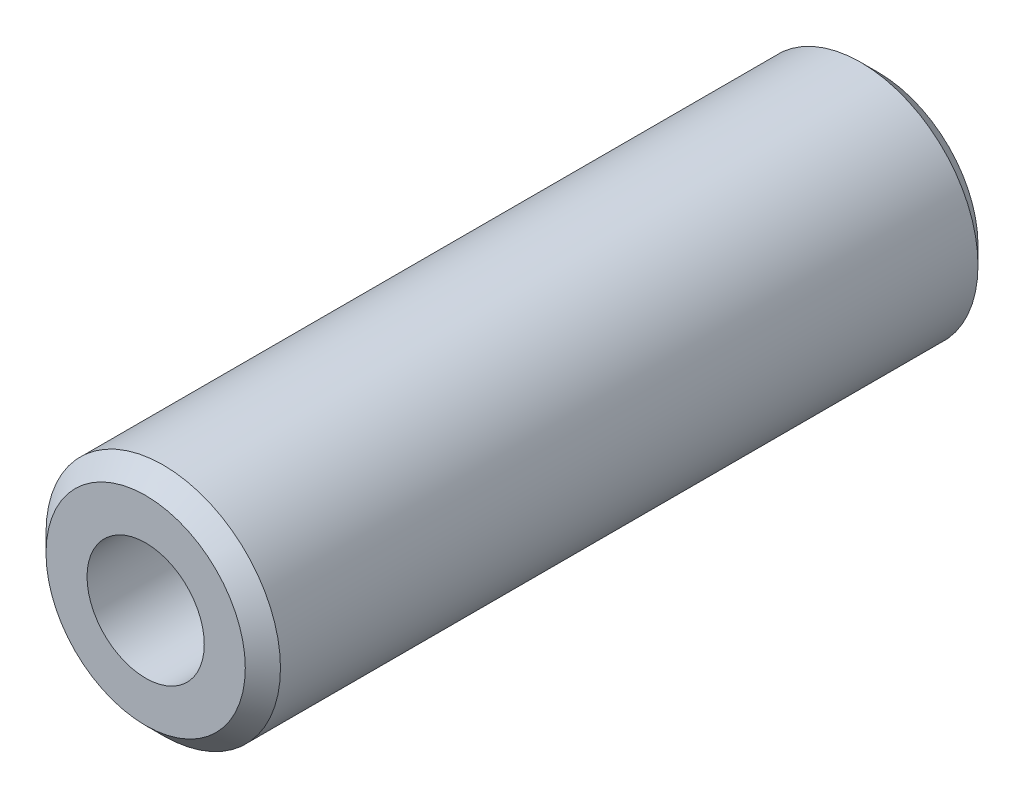
ISO-10303-21;
HEADER;
FILE_DESCRIPTION(('STEP AP214'),'2;1');
FILE_NAME('part.step','',(''),(''),'','','');
FILE_SCHEMA(('AUTOMOTIVE_DESIGN { 1 0 10303 214 1 1 1 1 }'));
ENDSEC;
DATA;
#1=APPLICATION_CONTEXT('core data for automotive mechanical design processes');
#2=APPLICATION_PROTOCOL_DEFINITION('international standard','automotive_design',2000,#1);
#3=PRODUCT_CONTEXT('',#1,'mechanical');
#4=PRODUCT('Part','Part','',(#3));
#5=PRODUCT_RELATED_PRODUCT_CATEGORY('part','',(#4));
#6=PRODUCT_DEFINITION_FORMATION('','',#4);
#7=PRODUCT_DEFINITION_CONTEXT('part definition',#1,'design');
#8=PRODUCT_DEFINITION('design','',#6,#7);
#9=PRODUCT_DEFINITION_SHAPE('','',#8);
#10=(LENGTH_UNIT() NAMED_UNIT(*) SI_UNIT(.MILLI.,.METRE.));
#11=(NAMED_UNIT(*) PLANE_ANGLE_UNIT() SI_UNIT($,.RADIAN.));
#12=(NAMED_UNIT(*) SI_UNIT($,.STERADIAN.) SOLID_ANGLE_UNIT());
#13=UNCERTAINTY_MEASURE_WITH_UNIT(LENGTH_MEASURE(1.E-05),#10,'distance_accuracy_value','');
#14=(GEOMETRIC_REPRESENTATION_CONTEXT(3) GLOBAL_UNCERTAINTY_ASSIGNED_CONTEXT((#13)) GLOBAL_UNIT_ASSIGNED_CONTEXT((#10,
#11,#12)) REPRESENTATION_CONTEXT('',''));
#15=CARTESIAN_POINT('',(0.,0.,0.));
#16=DIRECTION('',(0.,0.,1.));
#17=DIRECTION('',(1.,0.,0.));
#18=AXIS2_PLACEMENT_3D('',#15,#16,#17);
#19=CARTESIAN_POINT('',(0.,0.,12.5));
#20=DIRECTION('',(0.,0.,-1.));
#21=DIRECTION('',(-1.,0.,0.));
#22=AXIS2_PLACEMENT_3D('',#19,#20,#21);
#23=CYLINDRICAL_SURFACE('',#22,4.);
#24=CARTESIAN_POINT('',(0.,0.,-11.9));
#25=DIRECTION('',(0.,0.,1.));
#26=DIRECTION('',(1.,0.,0.));
#27=AXIS2_PLACEMENT_3D('',#24,#25,#26);
#28=CIRCLE('',#27,4.);
#29=CARTESIAN_POINT('',(4.,0.,-11.9));
#30=VERTEX_POINT('',#29);
#31=EDGE_CURVE('E55',#30,#30,#28,.T.);
#32=ORIENTED_EDGE('',*,*,#31,.T.);
#33=EDGE_LOOP('',(#32));
#34=FACE_BOUND('',#33,.T.);
#35=CARTESIAN_POINT('',(0.,0.,11.9));
#36=DIRECTION('',(0.,0.,1.));
#37=DIRECTION('',(1.,0.,0.));
#38=AXIS2_PLACEMENT_3D('',#35,#36,#37);
#39=CIRCLE('',#38,4.);
#40=CARTESIAN_POINT('',(4.,0.,11.9));
#41=VERTEX_POINT('',#40);
#42=EDGE_CURVE('E60',#41,#41,#39,.F.);
#43=ORIENTED_EDGE('',*,*,#42,.T.);
#44=EDGE_LOOP('',(#43));
#45=FACE_BOUND('',#44,.T.);
#46=ADVANCED_FACE('F42',(#34,#45),#23,.T.);
#47=CARTESIAN_POINT('',(0.,0.,12.5));
#48=DIRECTION('',(0.,0.,1.));
#49=DIRECTION('',(1.,0.,0.));
#50=AXIS2_PLACEMENT_3D('',#47,#48,#49);
#51=PLANE('',#50);
#52=CARTESIAN_POINT('',(0.,0.,12.5));
#53=DIRECTION('',(0.,0.,1.));
#54=DIRECTION('',(1.,0.,0.));
#55=AXIS2_PLACEMENT_3D('',#52,#53,#54);
#56=CIRCLE('',#55,2.);
#57=CARTESIAN_POINT('',(2.,0.,12.5));
#58=VERTEX_POINT('',#57);
#59=EDGE_CURVE('E66',#58,#58,#56,.T.);
#60=ORIENTED_EDGE('',*,*,#59,.F.);
#61=EDGE_LOOP('',(#60));
#62=FACE_BOUND('',#61,.T.);
#63=CARTESIAN_POINT('',(0.,0.,12.5));
#64=DIRECTION('',(0.,0.,1.));
#65=DIRECTION('',(1.,0.,0.));
#66=AXIS2_PLACEMENT_3D('',#63,#64,#65);
#67=CIRCLE('',#66,3.40000000000001);
#68=CARTESIAN_POINT('',(3.40000000000001,0.,12.5));
#69=VERTEX_POINT('',#68);
#70=EDGE_CURVE('E10',#69,#69,#67,.T.);
#71=ORIENTED_EDGE('',*,*,#70,.T.);
#72=EDGE_LOOP('',(#71));
#73=FACE_BOUND('',#72,.T.);
#74=ADVANCED_FACE('F80',(#62,#73),#51,.T.);
#75=CARTESIAN_POINT('',(0.,0.,-12.5));
#76=DIRECTION('',(0.,0.,1.));
#77=DIRECTION('',(1.,0.,0.));
#78=AXIS2_PLACEMENT_3D('',#75,#76,#77);
#79=PLANE('',#78);
#80=CARTESIAN_POINT('',(0.,0.,-12.5));
#81=DIRECTION('',(0.,0.,-1.));
#82=DIRECTION('',(-1.,0.,0.));
#83=AXIS2_PLACEMENT_3D('',#80,#81,#82);
#84=CIRCLE('',#83,2.);
#85=CARTESIAN_POINT('',(-2.,0.,-12.5));
#86=VERTEX_POINT('',#85);
#87=EDGE_CURVE('E70',#86,#86,#84,.T.);
#88=ORIENTED_EDGE('',*,*,#87,.F.);
#89=EDGE_LOOP('',(#88));
#90=FACE_BOUND('',#89,.T.);
#91=CARTESIAN_POINT('',(0.,0.,-12.5));
#92=DIRECTION('',(0.,0.,1.));
#93=DIRECTION('',(1.,0.,0.));
#94=AXIS2_PLACEMENT_3D('',#91,#92,#93);
#95=CIRCLE('',#94,3.40000000000001);
#96=CARTESIAN_POINT('',(3.40000000000001,0.,-12.5));
#97=VERTEX_POINT('',#96);
#98=EDGE_CURVE('E50',#97,#97,#95,.F.);
#99=ORIENTED_EDGE('',*,*,#98,.T.);
#100=EDGE_LOOP('',(#99));
#101=FACE_BOUND('',#100,.T.);
#102=ADVANCED_FACE('F77',(#90,#101),#79,.F.);
#103=CARTESIAN_POINT('',(0.,0.,-11.9));
#104=DIRECTION('',(0.,0.,1.));
#105=DIRECTION('',(1.,0.,0.));
#106=AXIS2_PLACEMENT_3D('',#103,#104,#105);
#107=CONICAL_SURFACE('',#106,4.,0.785398163397451);
#108=ORIENTED_EDGE('',*,*,#98,.F.);
#109=EDGE_LOOP('',(#108));
#110=FACE_BOUND('',#109,.T.);
#111=ORIENTED_EDGE('',*,*,#31,.F.);
#112=EDGE_LOOP('',(#111));
#113=FACE_BOUND('',#112,.T.);
#114=ADVANCED_FACE('F79',(#110,#113),#107,.T.);
#115=CARTESIAN_POINT('',(0.,0.,12.5));
#116=DIRECTION('',(0.,0.,-1.));
#117=DIRECTION('',(-1.,0.,0.));
#118=AXIS2_PLACEMENT_3D('',#115,#116,#117);
#119=CONICAL_SURFACE('',#118,3.40000000000001,0.785398163397447);
#120=ORIENTED_EDGE('',*,*,#42,.F.);
#121=EDGE_LOOP('',(#120));
#122=FACE_BOUND('',#121,.T.);
#123=ORIENTED_EDGE('',*,*,#70,.F.);
#124=EDGE_LOOP('',(#123));
#125=FACE_BOUND('',#124,.T.);
#126=ADVANCED_FACE('F44',(#122,#125),#119,.T.);
#127=CARTESIAN_POINT('',(0.,0.,29.5));
#128=DIRECTION('',(0.,0.,-1.));
#129=DIRECTION('',(-1.,0.,0.));
#130=AXIS2_PLACEMENT_3D('',#127,#128,#129);
#131=CYLINDRICAL_SURFACE('',#130,2.);
#132=ORIENTED_EDGE('',*,*,#59,.T.);
#133=EDGE_LOOP('',(#132));
#134=FACE_BOUND('',#133,.T.);
#135=ORIENTED_EDGE('',*,*,#87,.T.);
#136=EDGE_LOOP('',(#135));
#137=FACE_BOUND('',#136,.T.);
#138=ADVANCED_FACE('F75',(#134,#137),#131,.F.);
#139=CLOSED_SHELL('',(#46,#74,#102,#114,#126,#138));
#140=MANIFOLD_SOLID_BREP('B2',#139);
#141=ADVANCED_BREP_SHAPE_REPRESENTATION('',(#18,#140),#14);
#142=SHAPE_DEFINITION_REPRESENTATION(#9,#141);
ENDSEC;
END-ISO-10303-21;
